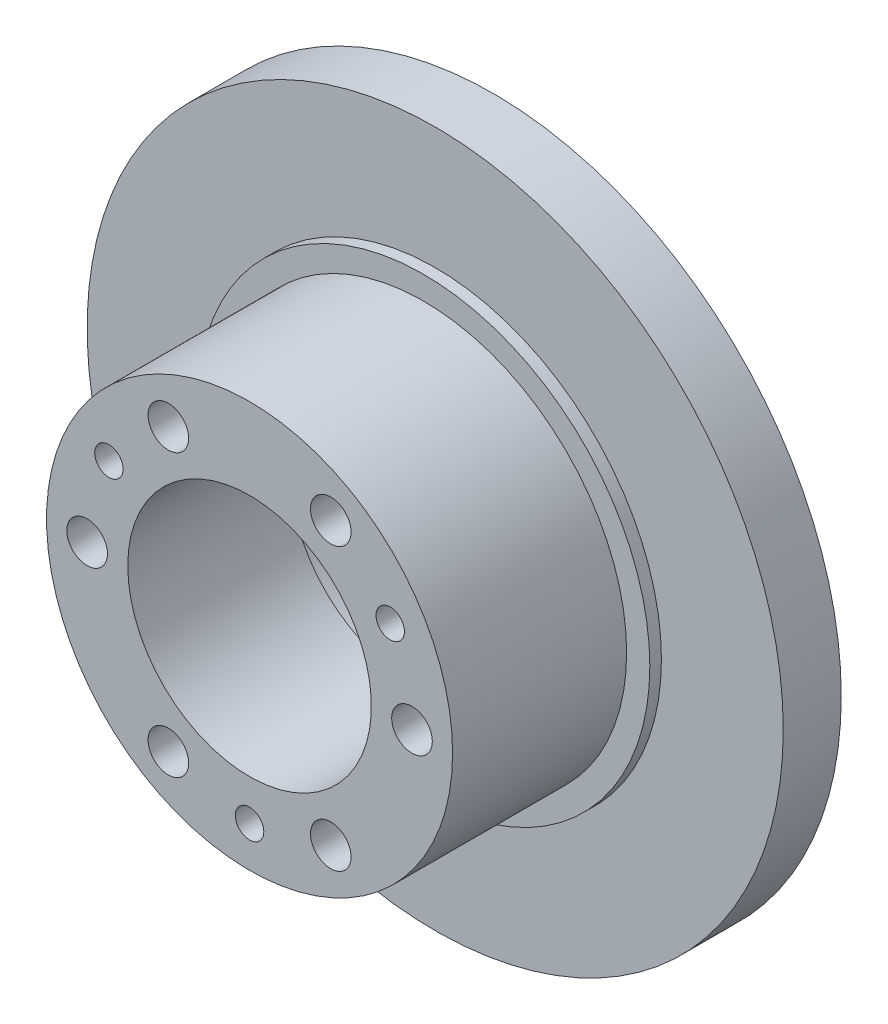
ISO-10303-21;
HEADER;
FILE_DESCRIPTION(('STEP AP214'),'2;1');
FILE_NAME('part.step','',(''),(''),'','','');
FILE_SCHEMA(('AUTOMOTIVE_DESIGN { 1 0 10303 214 1 1 1 1 }'));
ENDSEC;
DATA;
#1=APPLICATION_CONTEXT('core data for automotive mechanical design processes');
#2=APPLICATION_PROTOCOL_DEFINITION('international standard','automotive_design',2000,#1);
#3=PRODUCT_CONTEXT('',#1,'mechanical');
#4=PRODUCT('Part','Part','',(#3));
#5=PRODUCT_RELATED_PRODUCT_CATEGORY('part','',(#4));
#6=PRODUCT_DEFINITION_FORMATION('','',#4);
#7=PRODUCT_DEFINITION_CONTEXT('part definition',#1,'design');
#8=PRODUCT_DEFINITION('design','',#6,#7);
#9=PRODUCT_DEFINITION_SHAPE('','',#8);
#10=(LENGTH_UNIT() NAMED_UNIT(*) SI_UNIT(.MILLI.,.METRE.));
#11=(NAMED_UNIT(*) PLANE_ANGLE_UNIT() SI_UNIT($,.RADIAN.));
#12=(NAMED_UNIT(*) SI_UNIT($,.STERADIAN.) SOLID_ANGLE_UNIT());
#13=UNCERTAINTY_MEASURE_WITH_UNIT(LENGTH_MEASURE(1.E-05),#10,'distance_accuracy_value','');
#14=(GEOMETRIC_REPRESENTATION_CONTEXT(3) GLOBAL_UNCERTAINTY_ASSIGNED_CONTEXT((#13)) GLOBAL_UNIT_ASSIGNED_CONTEXT((#10,
#11,#12)) REPRESENTATION_CONTEXT('',''));
#15=CARTESIAN_POINT('',(0.,0.,0.));
#16=DIRECTION('',(0.,0.,1.));
#17=DIRECTION('',(1.,0.,0.));
#18=AXIS2_PLACEMENT_3D('',#15,#16,#17);
#19=CARTESIAN_POINT('',(0.,0.,5.));
#20=DIRECTION('',(0.,0.,-1.));
#21=DIRECTION('',(-1.,0.,0.));
#22=AXIS2_PLACEMENT_3D('',#19,#20,#21);
#23=CYLINDRICAL_SURFACE('',#22,30.);
#24=CARTESIAN_POINT('',(0.,0.,5.));
#25=DIRECTION('',(0.,0.,1.));
#26=DIRECTION('',(1.,0.,0.));
#27=AXIS2_PLACEMENT_3D('',#24,#25,#26);
#28=CIRCLE('',#27,30.);
#29=CARTESIAN_POINT('',(30.,0.,5.));
#30=VERTEX_POINT('',#29);
#31=EDGE_CURVE('E47',#30,#30,#28,.T.);
#32=ORIENTED_EDGE('',*,*,#31,.F.);
#33=EDGE_LOOP('',(#32));
#34=FACE_BOUND('',#33,.T.);
#35=CARTESIAN_POINT('',(0.,0.,0.));
#36=DIRECTION('',(0.,0.,1.));
#37=DIRECTION('',(1.,0.,0.));
#38=AXIS2_PLACEMENT_3D('',#35,#36,#37);
#39=CIRCLE('',#38,30.);
#40=CARTESIAN_POINT('',(30.,0.,0.));
#41=VERTEX_POINT('',#40);
#42=EDGE_CURVE('E55',#41,#41,#39,.T.);
#43=ORIENTED_EDGE('',*,*,#42,.T.);
#44=EDGE_LOOP('',(#43));
#45=FACE_BOUND('',#44,.T.);
#46=ADVANCED_FACE('F35',(#34,#45),#23,.T.);
#47=CARTESIAN_POINT('',(0.,0.,5.));
#48=DIRECTION('',(0.,0.,1.));
#49=DIRECTION('',(1.,0.,0.));
#50=AXIS2_PLACEMENT_3D('',#47,#48,#49);
#51=PLANE('',#50);
#52=CARTESIAN_POINT('',(0.,0.,5.));
#53=DIRECTION('',(0.,0.,1.));
#54=DIRECTION('',(1.,0.,0.));
#55=AXIS2_PLACEMENT_3D('',#52,#53,#54);
#56=CIRCLE('',#55,19.5);
#57=CARTESIAN_POINT('',(19.5,0.,5.));
#58=VERTEX_POINT('',#57);
#59=EDGE_CURVE('E42',#58,#58,#56,.T.);
#60=ORIENTED_EDGE('',*,*,#59,.F.);
#61=EDGE_LOOP('',(#60));
#62=FACE_BOUND('',#61,.T.);
#63=ORIENTED_EDGE('',*,*,#31,.T.);
#64=EDGE_LOOP('',(#63));
#65=FACE_BOUND('',#64,.T.);
#66=ADVANCED_FACE('F102',(#62,#65),#51,.T.);
#67=CARTESIAN_POINT('',(0.,0.,0.));
#68=DIRECTION('',(0.,0.,1.));
#69=DIRECTION('',(1.,0.,0.));
#70=AXIS2_PLACEMENT_3D('',#67,#68,#69);
#71=PLANE('',#70);
#72=CARTESIAN_POINT('',(24.5,0.,0.));
#73=DIRECTION('',(0.,0.,1.));
#74=DIRECTION('',(1.,0.,0.));
#75=AXIS2_PLACEMENT_3D('',#72,#73,#74);
#76=CIRCLE('',#75,2.);
#77=CARTESIAN_POINT('',(26.5,0.,0.));
#78=VERTEX_POINT('',#77);
#79=EDGE_CURVE('E38',#78,#78,#76,.F.);
#80=ORIENTED_EDGE('',*,*,#79,.F.);
#81=EDGE_LOOP('',(#80));
#82=FACE_BOUND('',#81,.T.);
#83=CARTESIAN_POINT('',(12.2500000000002,21.2176223927186,0.));
#84=DIRECTION('',(0.,0.,1.));
#85=DIRECTION('',(1.,0.,0.));
#86=AXIS2_PLACEMENT_3D('',#83,#84,#85);
#87=CIRCLE('',#86,2.);
#88=CARTESIAN_POINT('',(14.2500000000002,21.2176223927186,0.));
#89=VERTEX_POINT('',#88);
#90=EDGE_CURVE('E73',#89,#89,#87,.F.);
#91=ORIENTED_EDGE('',*,*,#90,.F.);
#92=EDGE_LOOP('',(#91));
#93=FACE_BOUND('',#92,.T.);
#94=CARTESIAN_POINT('',(-12.2499999999998,21.2176223927189,0.));
#95=DIRECTION('',(0.,0.,1.));
#96=DIRECTION('',(1.,0.,0.));
#97=AXIS2_PLACEMENT_3D('',#94,#95,#96);
#98=CIRCLE('',#97,2.);
#99=CARTESIAN_POINT('',(-10.2499999999998,21.2176223927189,0.));
#100=VERTEX_POINT('',#99);
#101=EDGE_CURVE('E71',#100,#100,#98,.F.);
#102=ORIENTED_EDGE('',*,*,#101,.F.);
#103=EDGE_LOOP('',(#102));
#104=FACE_BOUND('',#103,.T.);
#105=CARTESIAN_POINT('',(-24.5,1.71082585603314E-13,0.));
#106=DIRECTION('',(0.,0.,1.));
#107=DIRECTION('',(1.,0.,0.));
#108=AXIS2_PLACEMENT_3D('',#105,#106,#107);
#109=CIRCLE('',#108,2.);
#110=CARTESIAN_POINT('',(-22.5,1.71082585603314E-13,0.));
#111=VERTEX_POINT('',#110);
#112=EDGE_CURVE('E68',#111,#111,#109,.F.);
#113=ORIENTED_EDGE('',*,*,#112,.F.);
#114=EDGE_LOOP('',(#113));
#115=FACE_BOUND('',#114,.T.);
#116=CARTESIAN_POINT('',(-12.2500000000001,-21.2176223927187,0.));
#117=DIRECTION('',(0.,0.,1.));
#118=DIRECTION('',(1.,0.,0.));
#119=AXIS2_PLACEMENT_3D('',#116,#117,#118);
#120=CIRCLE('',#119,2.);
#121=CARTESIAN_POINT('',(-10.2500000000001,-21.2176223927187,0.));
#122=VERTEX_POINT('',#121);
#123=EDGE_CURVE('E64',#122,#122,#120,.F.);
#124=ORIENTED_EDGE('',*,*,#123,.F.);
#125=EDGE_LOOP('',(#124));
#126=FACE_BOUND('',#125,.T.);
#127=CARTESIAN_POINT('',(12.25,-21.2176223927188,0.));
#128=DIRECTION('',(0.,0.,1.));
#129=DIRECTION('',(1.,0.,0.));
#130=AXIS2_PLACEMENT_3D('',#127,#128,#129);
#131=CIRCLE('',#130,2.);
#132=CARTESIAN_POINT('',(14.25,-21.2176223927188,0.));
#133=VERTEX_POINT('',#132);
#134=EDGE_CURVE('E61',#133,#133,#131,.F.);
#135=ORIENTED_EDGE('',*,*,#134,.F.);
#136=EDGE_LOOP('',(#135));
#137=FACE_BOUND('',#136,.T.);
#138=CARTESIAN_POINT('',(0.,0.,0.));
#139=DIRECTION('',(0.,0.,-1.));
#140=DIRECTION('',(-1.,0.,0.));
#141=AXIS2_PLACEMENT_3D('',#138,#139,#140);
#142=CIRCLE('',#141,12.025);
#143=CARTESIAN_POINT('',(-12.025,0.,0.));
#144=VERTEX_POINT('',#143);
#145=EDGE_CURVE('E87',#144,#144,#142,.T.);
#146=ORIENTED_EDGE('',*,*,#145,.F.);
#147=EDGE_LOOP('',(#146));
#148=FACE_BOUND('',#147,.T.);
#149=ORIENTED_EDGE('',*,*,#42,.F.);
#150=EDGE_LOOP('',(#149));
#151=FACE_BOUND('',#150,.T.);
#152=ADVANCED_FACE('F98',(#82,#93,#104,#115,#126,#137,#148,#151),#71,.F.);
#153=CARTESIAN_POINT('',(0.,0.,6.));
#154=DIRECTION('',(0.,0.,-1.));
#155=DIRECTION('',(-1.,0.,0.));
#156=AXIS2_PLACEMENT_3D('',#153,#154,#155);
#157=CYLINDRICAL_SURFACE('',#156,19.5);
#158=CARTESIAN_POINT('',(0.,0.,6.));
#159=DIRECTION('',(0.,0.,1.));
#160=DIRECTION('',(1.,0.,0.));
#161=AXIS2_PLACEMENT_3D('',#158,#159,#160);
#162=CIRCLE('',#161,19.5);
#163=CARTESIAN_POINT('',(19.5,0.,6.));
#164=VERTEX_POINT('',#163);
#165=EDGE_CURVE('E53',#164,#164,#162,.T.);
#166=ORIENTED_EDGE('',*,*,#165,.F.);
#167=EDGE_LOOP('',(#166));
#168=FACE_BOUND('',#167,.T.);
#169=ORIENTED_EDGE('',*,*,#59,.T.);
#170=EDGE_LOOP('',(#169));
#171=FACE_BOUND('',#170,.T.);
#172=ADVANCED_FACE('F101',(#168,#171),#157,.T.);
#173=CARTESIAN_POINT('',(0.,0.,6.));
#174=DIRECTION('',(0.,0.,1.));
#175=DIRECTION('',(1.,0.,0.));
#176=AXIS2_PLACEMENT_3D('',#173,#174,#175);
#177=PLANE('',#176);
#178=CARTESIAN_POINT('',(0.,0.,6.));
#179=DIRECTION('',(0.,0.,1.));
#180=DIRECTION('',(1.,0.,0.));
#181=AXIS2_PLACEMENT_3D('',#178,#179,#180);
#182=CIRCLE('',#181,17.5);
#183=CARTESIAN_POINT('',(17.5,0.,6.));
#184=VERTEX_POINT('',#183);
#185=EDGE_CURVE('E10',#184,#184,#182,.T.);
#186=ORIENTED_EDGE('',*,*,#185,.F.);
#187=EDGE_LOOP('',(#186));
#188=FACE_BOUND('',#187,.T.);
#189=ORIENTED_EDGE('',*,*,#165,.T.);
#190=EDGE_LOOP('',(#189));
#191=FACE_BOUND('',#190,.T.);
#192=ADVANCED_FACE('F121',(#188,#191),#177,.T.);
#193=CARTESIAN_POINT('',(0.,0.,21.));
#194=DIRECTION('',(0.,0.,-1.));
#195=DIRECTION('',(-1.,0.,0.));
#196=AXIS2_PLACEMENT_3D('',#193,#194,#195);
#197=CYLINDRICAL_SURFACE('',#196,17.5);
#198=CARTESIAN_POINT('',(0.,0.,21.));
#199=DIRECTION('',(0.,0.,1.));
#200=DIRECTION('',(1.,0.,0.));
#201=AXIS2_PLACEMENT_3D('',#198,#199,#200);
#202=CIRCLE('',#201,17.5);
#203=CARTESIAN_POINT('',(17.5,0.,21.));
#204=VERTEX_POINT('',#203);
#205=EDGE_CURVE('E51',#204,#204,#202,.T.);
#206=ORIENTED_EDGE('',*,*,#205,.F.);
#207=EDGE_LOOP('',(#206));
#208=FACE_BOUND('',#207,.T.);
#209=ORIENTED_EDGE('',*,*,#185,.T.);
#210=EDGE_LOOP('',(#209));
#211=FACE_BOUND('',#210,.T.);
#212=ADVANCED_FACE('F125',(#208,#211),#197,.T.);
#213=CARTESIAN_POINT('',(0.,0.,21.));
#214=DIRECTION('',(0.,0.,1.));
#215=DIRECTION('',(1.,0.,0.));
#216=AXIS2_PLACEMENT_3D('',#213,#214,#215);
#217=PLANE('',#216);
#218=CARTESIAN_POINT('',(12.1243556529821,7.00000000000002,21.));
#219=DIRECTION('',(0.,0.,1.));
#220=DIRECTION('',(1.,0.,0.));
#221=AXIS2_PLACEMENT_3D('',#218,#219,#220);
#222=CIRCLE('',#221,1.225);
#223=CARTESIAN_POINT('',(13.3493556529821,7.00000000000002,21.));
#224=VERTEX_POINT('',#223);
#225=EDGE_CURVE('E270',#224,#224,#222,.T.);
#226=ORIENTED_EDGE('',*,*,#225,.F.);
#227=EDGE_LOOP('',(#226));
#228=FACE_BOUND('',#227,.T.);
#229=CARTESIAN_POINT('',(5.86982504876221E-13,-14.0000000000003,21.));
#230=DIRECTION('',(0.,0.,1.));
#231=DIRECTION('',(1.,0.,0.));
#232=AXIS2_PLACEMENT_3D('',#229,#230,#231);
#233=CIRCLE('',#232,1.22499999999981);
#234=CARTESIAN_POINT('',(1.22500000000039,-14.0000000000003,21.));
#235=VERTEX_POINT('',#234);
#236=EDGE_CURVE('E281',#235,#235,#233,.T.);
#237=ORIENTED_EDGE('',*,*,#236,.F.);
#238=EDGE_LOOP('',(#237));
#239=FACE_BOUND('',#238,.T.);
#240=CARTESIAN_POINT('',(-12.1243556529822,6.99999999999932,21.));
#241=DIRECTION('',(0.,0.,1.));
#242=DIRECTION('',(1.,0.,0.));
#243=AXIS2_PLACEMENT_3D('',#240,#241,#242);
#244=CIRCLE('',#243,1.22500000000048);
#245=CARTESIAN_POINT('',(-10.8993556529817,6.99999999999932,21.));
#246=VERTEX_POINT('',#245);
#247=EDGE_CURVE('E287',#246,#246,#244,.T.);
#248=ORIENTED_EDGE('',*,*,#247,.F.);
#249=EDGE_LOOP('',(#248));
#250=FACE_BOUND('',#249,.T.);
#251=CARTESIAN_POINT('',(14.,0.,21.));
#252=DIRECTION('',(0.,0.,1.));
#253=DIRECTION('',(1.,0.,0.));
#254=AXIS2_PLACEMENT_3D('',#251,#252,#253);
#255=CIRCLE('',#254,1.75);
#256=CARTESIAN_POINT('',(15.75,0.,21.));
#257=VERTEX_POINT('',#256);
#258=EDGE_CURVE('E294',#257,#257,#255,.T.);
#259=ORIENTED_EDGE('',*,*,#258,.F.);
#260=EDGE_LOOP('',(#259));
#261=FACE_BOUND('',#260,.T.);
#262=CARTESIAN_POINT('',(7.00000000000014,12.1243556529821,21.));
#263=DIRECTION('',(0.,0.,1.));
#264=DIRECTION('',(1.,0.,0.));
#265=AXIS2_PLACEMENT_3D('',#262,#263,#264);
#266=CIRCLE('',#265,1.75);
#267=CARTESIAN_POINT('',(8.75000000000014,12.1243556529821,21.));
#268=VERTEX_POINT('',#267);
#269=EDGE_CURVE('E269',#268,#268,#266,.T.);
#270=ORIENTED_EDGE('',*,*,#269,.F.);
#271=EDGE_LOOP('',(#270));
#272=FACE_BOUND('',#271,.T.);
#273=CARTESIAN_POINT('',(-6.99999999999989,12.1243556529822,21.));
#274=DIRECTION('',(0.,0.,1.));
#275=DIRECTION('',(1.,0.,0.));
#276=AXIS2_PLACEMENT_3D('',#273,#274,#275);
#277=CIRCLE('',#276,1.75);
#278=CARTESIAN_POINT('',(-5.24999999999989,12.1243556529822,21.));
#279=VERTEX_POINT('',#278);
#280=EDGE_CURVE('E299',#279,#279,#277,.T.);
#281=ORIENTED_EDGE('',*,*,#280,.F.);
#282=EDGE_LOOP('',(#281));
#283=FACE_BOUND('',#282,.T.);
#284=CARTESIAN_POINT('',(-14.,0.,21.));
#285=DIRECTION('',(0.,0.,1.));
#286=DIRECTION('',(1.,0.,0.));
#287=AXIS2_PLACEMENT_3D('',#284,#285,#286);
#288=CIRCLE('',#287,1.75);
#289=CARTESIAN_POINT('',(-12.25,0.,21.));
#290=VERTEX_POINT('',#289);
#291=EDGE_CURVE('E315',#290,#290,#288,.T.);
#292=ORIENTED_EDGE('',*,*,#291,.F.);
#293=EDGE_LOOP('',(#292));
#294=FACE_BOUND('',#293,.T.);
#295=CARTESIAN_POINT('',(-7.00000000000006,-12.1243556529821,21.));
#296=DIRECTION('',(0.,0.,1.));
#297=DIRECTION('',(1.,0.,0.));
#298=AXIS2_PLACEMENT_3D('',#295,#296,#297);
#299=CIRCLE('',#298,1.75);
#300=CARTESIAN_POINT('',(-5.25000000000006,-12.1243556529821,21.));
#301=VERTEX_POINT('',#300);
#302=EDGE_CURVE('E309',#301,#301,#299,.T.);
#303=ORIENTED_EDGE('',*,*,#302,.F.);
#304=EDGE_LOOP('',(#303));
#305=FACE_BOUND('',#304,.T.);
#306=CARTESIAN_POINT('',(6.99999999999997,-12.1243556529822,21.));
#307=DIRECTION('',(0.,0.,1.));
#308=DIRECTION('',(1.,0.,0.));
#309=AXIS2_PLACEMENT_3D('',#306,#307,#308);
#310=CIRCLE('',#309,1.75);
#311=CARTESIAN_POINT('',(8.74999999999997,-12.1243556529822,21.));
#312=VERTEX_POINT('',#311);
#313=EDGE_CURVE('E303',#312,#312,#310,.T.);
#314=ORIENTED_EDGE('',*,*,#313,.F.);
#315=EDGE_LOOP('',(#314));
#316=FACE_BOUND('',#315,.T.);
#317=CARTESIAN_POINT('',(0.,0.,21.));
#318=DIRECTION('',(0.,0.,-1.));
#319=DIRECTION('',(-1.,0.,0.));
#320=AXIS2_PLACEMENT_3D('',#317,#318,#319);
#321=CIRCLE('',#320,10.5);
#322=CARTESIAN_POINT('',(-10.5,0.,21.));
#323=VERTEX_POINT('',#322);
#324=EDGE_CURVE('E82',#323,#323,#321,.T.);
#325=ORIENTED_EDGE('',*,*,#324,.T.);
#326=EDGE_LOOP('',(#325));
#327=FACE_BOUND('',#326,.T.);
#328=ORIENTED_EDGE('',*,*,#205,.T.);
#329=EDGE_LOOP('',(#328));
#330=FACE_BOUND('',#329,.T.);
#331=ADVANCED_FACE('F129',(#228,#239,#250,#261,#272,#283,#294,#305,#316,#327,#330),#217,.T.);
#332=CARTESIAN_POINT('',(0.,0.,7.));
#333=DIRECTION('',(0.,0.,-1.));
#334=DIRECTION('',(-1.,0.,0.));
#335=AXIS2_PLACEMENT_3D('',#332,#333,#334);
#336=CYLINDRICAL_SURFACE('',#335,12.025);
#337=CARTESIAN_POINT('',(0.,0.,7.));
#338=DIRECTION('',(0.,0.,-1.));
#339=DIRECTION('',(-1.,0.,0.));
#340=AXIS2_PLACEMENT_3D('',#337,#338,#339);
#341=CIRCLE('',#340,12.025);
#342=CARTESIAN_POINT('',(-12.025,0.,7.));
#343=VERTEX_POINT('',#342);
#344=EDGE_CURVE('E91',#343,#343,#341,.T.);
#345=ORIENTED_EDGE('',*,*,#344,.F.);
#346=EDGE_LOOP('',(#345));
#347=FACE_BOUND('',#346,.T.);
#348=ORIENTED_EDGE('',*,*,#145,.T.);
#349=EDGE_LOOP('',(#348));
#350=FACE_BOUND('',#349,.T.);
#351=ADVANCED_FACE('F96',(#347,#350),#336,.F.);
#352=CARTESIAN_POINT('',(0.,0.,7.));
#353=DIRECTION('',(0.,0.,-1.));
#354=DIRECTION('',(-1.,0.,0.));
#355=AXIS2_PLACEMENT_3D('',#352,#353,#354);
#356=PLANE('',#355);
#357=CARTESIAN_POINT('',(0.,0.,7.));
#358=DIRECTION('',(0.,0.,-1.));
#359=DIRECTION('',(-1.,0.,0.));
#360=AXIS2_PLACEMENT_3D('',#357,#358,#359);
#361=CIRCLE('',#360,10.5);
#362=CARTESIAN_POINT('',(-10.5,0.,7.));
#363=VERTEX_POINT('',#362);
#364=EDGE_CURVE('E78',#363,#363,#361,.T.);
#365=ORIENTED_EDGE('',*,*,#364,.F.);
#366=EDGE_LOOP('',(#365));
#367=FACE_BOUND('',#366,.T.);
#368=ORIENTED_EDGE('',*,*,#344,.T.);
#369=EDGE_LOOP('',(#368));
#370=FACE_BOUND('',#369,.T.);
#371=ADVANCED_FACE('F136',(#367,#370),#356,.T.);
#372=CARTESIAN_POINT('',(0.,0.,21.));
#373=DIRECTION('',(0.,0.,-1.));
#374=DIRECTION('',(-1.,0.,0.));
#375=AXIS2_PLACEMENT_3D('',#372,#373,#374);
#376=CYLINDRICAL_SURFACE('',#375,10.5);
#377=CARTESIAN_POINT('',(-10.5,0.,21.));
#378=CARTESIAN_POINT('',(-10.5,0.,20.8541666666667));
#379=CARTESIAN_POINT('',(-10.5,0.,20.7083333333333));
#380=CARTESIAN_POINT('',(-10.5,0.,20.4166666666667));
#381=CARTESIAN_POINT('',(-10.5,0.,20.2708333333333));
#382=CARTESIAN_POINT('',(-10.5,0.,19.9791666666667));
#383=CARTESIAN_POINT('',(-10.5,0.,19.8333333333333));
#384=CARTESIAN_POINT('',(-10.5,0.,19.5416666666667));
#385=CARTESIAN_POINT('',(-10.5,0.,19.3958333333333));
#386=CARTESIAN_POINT('',(-10.5,0.,19.1041666666667));
#387=CARTESIAN_POINT('',(-10.5,0.,18.9583333333333));
#388=CARTESIAN_POINT('',(-10.5,0.,18.6666666666667));
#389=CARTESIAN_POINT('',(-10.5,0.,18.5208333333333));
#390=CARTESIAN_POINT('',(-10.5,0.,18.2291666666667));
#391=CARTESIAN_POINT('',(-10.5,0.,18.0833333333333));
#392=CARTESIAN_POINT('',(-10.5,0.,17.7916666666667));
#393=CARTESIAN_POINT('',(-10.5,0.,17.6458333333333));
#394=CARTESIAN_POINT('',(-10.5,0.,17.3541666666667));
#395=CARTESIAN_POINT('',(-10.5,0.,17.2083333333333));
#396=CARTESIAN_POINT('',(-10.5,0.,16.9166666666667));
#397=CARTESIAN_POINT('',(-10.5,0.,16.7708333333333));
#398=CARTESIAN_POINT('',(-10.5,0.,16.4791666666667));
#399=CARTESIAN_POINT('',(-10.5,0.,16.3333333333333));
#400=CARTESIAN_POINT('',(-10.5,0.,16.0416666666667));
#401=CARTESIAN_POINT('',(-10.5,0.,15.8958333333333));
#402=CARTESIAN_POINT('',(-10.5,0.,15.6041666666667));
#403=CARTESIAN_POINT('',(-10.5,0.,15.4583333333333));
#404=CARTESIAN_POINT('',(-10.5,0.,15.1666666666667));
#405=CARTESIAN_POINT('',(-10.5,0.,15.0208333333333));
#406=CARTESIAN_POINT('',(-10.5,0.,14.7291666666667));
#407=CARTESIAN_POINT('',(-10.5,0.,14.5833333333333));
#408=CARTESIAN_POINT('',(-10.5,0.,14.2916666666667));
#409=CARTESIAN_POINT('',(-10.5,0.,14.1458333333333));
#410=CARTESIAN_POINT('',(-10.5,0.,13.8541666666667));
#411=CARTESIAN_POINT('',(-10.5,0.,13.7083333333333));
#412=CARTESIAN_POINT('',(-10.5,0.,13.4166666666667));
#413=CARTESIAN_POINT('',(-10.5,0.,13.2708333333333));
#414=CARTESIAN_POINT('',(-10.5,0.,12.9791666666667));
#415=CARTESIAN_POINT('',(-10.5,0.,12.8333333333333));
#416=CARTESIAN_POINT('',(-10.5,0.,12.5416666666667));
#417=CARTESIAN_POINT('',(-10.5,0.,12.3958333333333));
#418=CARTESIAN_POINT('',(-10.5,0.,12.1041666666667));
#419=CARTESIAN_POINT('',(-10.5,0.,11.9583333333333));
#420=CARTESIAN_POINT('',(-10.5,0.,11.6666666666667));
#421=CARTESIAN_POINT('',(-10.5,0.,11.5208333333333));
#422=CARTESIAN_POINT('',(-10.5,0.,11.2291666666667));
#423=CARTESIAN_POINT('',(-10.5,0.,11.0833333333333));
#424=CARTESIAN_POINT('',(-10.5,0.,10.7916666666667));
#425=CARTESIAN_POINT('',(-10.5,0.,10.6458333333333));
#426=CARTESIAN_POINT('',(-10.5,0.,10.3541666666667));
#427=CARTESIAN_POINT('',(-10.5,0.,10.2083333333333));
#428=CARTESIAN_POINT('',(-10.5,0.,9.91666666666667));
#429=CARTESIAN_POINT('',(-10.5,0.,9.77083333333333));
#430=CARTESIAN_POINT('',(-10.5,0.,9.47916666666667));
#431=CARTESIAN_POINT('',(-10.5,0.,9.33333333333333));
#432=CARTESIAN_POINT('',(-10.5,0.,9.04166666666667));
#433=CARTESIAN_POINT('',(-10.5,0.,8.89583333333333));
#434=CARTESIAN_POINT('',(-10.5,0.,8.60416666666667));
#435=CARTESIAN_POINT('',(-10.5,0.,8.45833333333333));
#436=CARTESIAN_POINT('',(-10.5,0.,8.16666666666667));
#437=CARTESIAN_POINT('',(-10.5,0.,8.02083333333333));
#438=CARTESIAN_POINT('',(-10.5,0.,7.72916666666667));
#439=CARTESIAN_POINT('',(-10.5,0.,7.58333333333333));
#440=CARTESIAN_POINT('',(-10.5,0.,7.29166666666667));
#441=CARTESIAN_POINT('',(-10.5,0.,7.14583333333333));
#442=CARTESIAN_POINT('',(-10.5,0.,7.));
#443=B_SPLINE_CURVE_WITH_KNOTS('',3,(#377,#378,#379,#380,#381,#382,#383,#384,#385,#386,#387,
#388,#389,#390,#391,#392,#393,#394,#395,#396,#397,#398,#399,#400,#401,#402,#403,#404,#405,#406,
#407,#408,#409,#410,#411,#412,#413,#414,#415,#416,#417,#418,#419,#420,#421,#422,#423,#424,#425,
#426,#427,#428,#429,#430,#431,#432,#433,#434,#435,#436,#437,#438,#439,#440,#441,#442),
.UNSPECIFIED.,.F.,.F.,(4,2,2,2,2,2,2,2,2,2,2,2,2,2,2,2,2,2,2,2,2,2,2,2,2,2,2,2,2,2,2,2,4),(0.,
0.4375,0.875000000000001,1.3125,1.75,2.1875,2.625,3.0625,3.5,3.9375,4.375,4.8125,5.25,5.6875,
6.125,6.5625,7.,7.4375,7.875,8.3125,8.75,9.1875,9.625,10.0625,10.5,10.9375,11.375,11.8125,12.25,
12.6875,13.125,13.5625,14.),.UNSPECIFIED.);
#444=EDGE_CURVE('BSEAM140',#323,#363,#443,.T.);
#445=ORIENTED_EDGE('',*,*,#324,.F.);
#446=ORIENTED_EDGE('',*,*,#364,.T.);
#447=ORIENTED_EDGE('',*,*,#444,.T.);
#448=ORIENTED_EDGE('',*,*,#444,.F.);
#449=EDGE_LOOP('',(#445,#447,#446,#448));
#450=FACE_BOUND('',#449,.T.);
#451=ADVANCED_FACE('F140',(#450),#376,.F.);
#452=CARTESIAN_POINT('',(12.25,-21.2176223927188,4.));
#453=DIRECTION('',(0.,0.,-1.));
#454=DIRECTION('',(-1.,0.,0.));
#455=AXIS2_PLACEMENT_3D('',#452,#453,#454);
#456=CYLINDRICAL_SURFACE('',#455,2.);
#457=CARTESIAN_POINT('',(12.25,-21.2176223927188,4.));
#458=DIRECTION('',(0.,0.,1.));
#459=DIRECTION('',(1.,0.,0.));
#460=AXIS2_PLACEMENT_3D('',#457,#458,#459);
#461=CIRCLE('',#460,2.);
#462=CARTESIAN_POINT('',(14.25,-21.2176223927188,4.));
#463=VERTEX_POINT('',#462);
#464=EDGE_CURVE('E325',#463,#463,#461,.T.);
#465=ORIENTED_EDGE('',*,*,#464,.T.);
#466=EDGE_LOOP('',(#465));
#467=FACE_BOUND('',#466,.T.);
#468=ORIENTED_EDGE('',*,*,#134,.T.);
#469=EDGE_LOOP('',(#468));
#470=FACE_BOUND('',#469,.T.);
#471=ADVANCED_FACE('F144',(#467,#470),#456,.F.);
#472=CARTESIAN_POINT('',(12.25,-21.2176223927188,4.));
#473=DIRECTION('',(0.,0.,1.));
#474=DIRECTION('',(1.,0.,0.));
#475=AXIS2_PLACEMENT_3D('',#472,#473,#474);
#476=PLANE('',#475);
#477=ORIENTED_EDGE('',*,*,#464,.F.);
#478=EDGE_LOOP('',(#477));
#479=FACE_BOUND('',#478,.T.);
#480=ADVANCED_FACE('F167',(#479),#476,.F.);
#481=CARTESIAN_POINT('',(-12.2500000000001,-21.2176223927187,4.));
#482=DIRECTION('',(0.,0.,-1.));
#483=DIRECTION('',(-1.,0.,0.));
#484=AXIS2_PLACEMENT_3D('',#481,#482,#483);
#485=CYLINDRICAL_SURFACE('',#484,2.);
#486=CARTESIAN_POINT('',(-12.2500000000001,-21.2176223927187,4.));
#487=DIRECTION('',(0.,0.,1.));
#488=DIRECTION('',(1.,0.,0.));
#489=AXIS2_PLACEMENT_3D('',#486,#487,#488);
#490=CIRCLE('',#489,2.);
#491=CARTESIAN_POINT('',(-10.2500000000001,-21.2176223927187,4.));
#492=VERTEX_POINT('',#491);
#493=EDGE_CURVE('E331',#492,#492,#490,.T.);
#494=ORIENTED_EDGE('',*,*,#493,.T.);
#495=EDGE_LOOP('',(#494));
#496=FACE_BOUND('',#495,.T.);
#497=ORIENTED_EDGE('',*,*,#123,.T.);
#498=EDGE_LOOP('',(#497));
#499=FACE_BOUND('',#498,.T.);
#500=ADVANCED_FACE('F164',(#496,#499),#485,.F.);
#501=CARTESIAN_POINT('',(-12.2500000000001,-21.2176223927187,4.));
#502=DIRECTION('',(0.,0.,1.));
#503=DIRECTION('',(1.,0.,0.));
#504=AXIS2_PLACEMENT_3D('',#501,#502,#503);
#505=PLANE('',#504);
#506=ORIENTED_EDGE('',*,*,#493,.F.);
#507=EDGE_LOOP('',(#506));
#508=FACE_BOUND('',#507,.T.);
#509=ADVANCED_FACE('F159',(#508),#505,.F.);
#510=CARTESIAN_POINT('',(-24.5,1.71082585603314E-13,4.));
#511=DIRECTION('',(0.,0.,-1.));
#512=DIRECTION('',(-1.,0.,0.));
#513=AXIS2_PLACEMENT_3D('',#510,#511,#512);
#514=CYLINDRICAL_SURFACE('',#513,2.);
#515=CARTESIAN_POINT('',(-24.5,1.71082585603314E-13,4.));
#516=DIRECTION('',(0.,0.,1.));
#517=DIRECTION('',(1.,0.,0.));
#518=AXIS2_PLACEMENT_3D('',#515,#516,#517);
#519=CIRCLE('',#518,2.);
#520=CARTESIAN_POINT('',(-22.5,1.71082585603314E-13,4.));
#521=VERTEX_POINT('',#520);
#522=EDGE_CURVE('E334',#521,#521,#519,.T.);
#523=ORIENTED_EDGE('',*,*,#522,.T.);
#524=EDGE_LOOP('',(#523));
#525=FACE_BOUND('',#524,.T.);
#526=ORIENTED_EDGE('',*,*,#112,.T.);
#527=EDGE_LOOP('',(#526));
#528=FACE_BOUND('',#527,.T.);
#529=ADVANCED_FACE('F156',(#525,#528),#514,.F.);
#530=CARTESIAN_POINT('',(-24.5,1.71082585603314E-13,4.));
#531=DIRECTION('',(0.,0.,1.));
#532=DIRECTION('',(1.,0.,0.));
#533=AXIS2_PLACEMENT_3D('',#530,#531,#532);
#534=PLANE('',#533);
#535=ORIENTED_EDGE('',*,*,#522,.F.);
#536=EDGE_LOOP('',(#535));
#537=FACE_BOUND('',#536,.T.);
#538=ADVANCED_FACE('F150',(#537),#534,.F.);
#539=CARTESIAN_POINT('',(-12.2499999999998,21.2176223927189,4.));
#540=DIRECTION('',(0.,0.,-1.));
#541=DIRECTION('',(-1.,0.,0.));
#542=AXIS2_PLACEMENT_3D('',#539,#540,#541);
#543=CYLINDRICAL_SURFACE('',#542,2.);
#544=CARTESIAN_POINT('',(-12.2499999999998,21.2176223927189,4.));
#545=DIRECTION('',(0.,0.,1.));
#546=DIRECTION('',(1.,0.,0.));
#547=AXIS2_PLACEMENT_3D('',#544,#545,#546);
#548=CIRCLE('',#547,2.);
#549=CARTESIAN_POINT('',(-10.2499999999998,21.2176223927189,4.));
#550=VERTEX_POINT('',#549);
#551=EDGE_CURVE('E328',#550,#550,#548,.T.);
#552=ORIENTED_EDGE('',*,*,#551,.T.);
#553=EDGE_LOOP('',(#552));
#554=FACE_BOUND('',#553,.T.);
#555=ORIENTED_EDGE('',*,*,#101,.T.);
#556=EDGE_LOOP('',(#555));
#557=FACE_BOUND('',#556,.T.);
#558=ADVANCED_FACE('F146',(#554,#557),#543,.F.);
#559=CARTESIAN_POINT('',(-12.2499999999998,21.2176223927189,4.));
#560=DIRECTION('',(0.,0.,1.));
#561=DIRECTION('',(1.,0.,0.));
#562=AXIS2_PLACEMENT_3D('',#559,#560,#561);
#563=PLANE('',#562);
#564=ORIENTED_EDGE('',*,*,#551,.F.);
#565=EDGE_LOOP('',(#564));
#566=FACE_BOUND('',#565,.T.);
#567=ADVANCED_FACE('F149',(#566),#563,.F.);
#568=CARTESIAN_POINT('',(12.2500000000002,21.2176223927186,4.));
#569=DIRECTION('',(0.,0.,-1.));
#570=DIRECTION('',(-1.,0.,0.));
#571=AXIS2_PLACEMENT_3D('',#568,#569,#570);
#572=CYLINDRICAL_SURFACE('',#571,2.);
#573=CARTESIAN_POINT('',(12.2500000000002,21.2176223927186,4.));
#574=DIRECTION('',(0.,0.,1.));
#575=DIRECTION('',(1.,0.,0.));
#576=AXIS2_PLACEMENT_3D('',#573,#574,#575);
#577=CIRCLE('',#576,2.);
#578=CARTESIAN_POINT('',(14.2500000000002,21.2176223927186,4.));
#579=VERTEX_POINT('',#578);
#580=EDGE_CURVE('E293',#579,#579,#577,.T.);
#581=ORIENTED_EDGE('',*,*,#580,.T.);
#582=EDGE_LOOP('',(#581));
#583=FACE_BOUND('',#582,.T.);
#584=ORIENTED_EDGE('',*,*,#90,.T.);
#585=EDGE_LOOP('',(#584));
#586=FACE_BOUND('',#585,.T.);
#587=ADVANCED_FACE('F154',(#583,#586),#572,.F.);
#588=CARTESIAN_POINT('',(12.2500000000002,21.2176223927186,4.));
#589=DIRECTION('',(0.,0.,1.));
#590=DIRECTION('',(1.,0.,0.));
#591=AXIS2_PLACEMENT_3D('',#588,#589,#590);
#592=PLANE('',#591);
#593=ORIENTED_EDGE('',*,*,#580,.F.);
#594=EDGE_LOOP('',(#593));
#595=FACE_BOUND('',#594,.T.);
#596=ADVANCED_FACE('F180',(#595),#592,.F.);
#597=CARTESIAN_POINT('',(24.5,0.,4.));
#598=DIRECTION('',(0.,0.,-1.));
#599=DIRECTION('',(-1.,0.,0.));
#600=AXIS2_PLACEMENT_3D('',#597,#598,#599);
#601=CYLINDRICAL_SURFACE('',#600,2.);
#602=CARTESIAN_POINT('',(24.5,0.,4.));
#603=DIRECTION('',(0.,0.,1.));
#604=DIRECTION('',(1.,0.,0.));
#605=AXIS2_PLACEMENT_3D('',#602,#603,#604);
#606=CIRCLE('',#605,2.);
#607=CARTESIAN_POINT('',(26.5,0.,4.));
#608=VERTEX_POINT('',#607);
#609=EDGE_CURVE('E65',#608,#608,#606,.T.);
#610=ORIENTED_EDGE('',*,*,#609,.T.);
#611=EDGE_LOOP('',(#610));
#612=FACE_BOUND('',#611,.T.);
#613=ORIENTED_EDGE('',*,*,#79,.T.);
#614=EDGE_LOOP('',(#613));
#615=FACE_BOUND('',#614,.T.);
#616=ADVANCED_FACE('F184',(#612,#615),#601,.F.);
#617=CARTESIAN_POINT('',(24.5,0.,4.));
#618=DIRECTION('',(0.,0.,1.));
#619=DIRECTION('',(1.,0.,0.));
#620=AXIS2_PLACEMENT_3D('',#617,#618,#619);
#621=PLANE('',#620);
#622=ORIENTED_EDGE('',*,*,#609,.F.);
#623=EDGE_LOOP('',(#622));
#624=FACE_BOUND('',#623,.T.);
#625=ADVANCED_FACE('F188',(#624),#621,.F.);
#626=CARTESIAN_POINT('',(6.99999999999997,-12.1243556529822,11.));
#627=DIRECTION('',(0.,0.,1.));
#628=DIRECTION('',(1.,0.,0.));
#629=AXIS2_PLACEMENT_3D('',#626,#627,#628);
#630=CYLINDRICAL_SURFACE('',#629,1.75);
#631=CARTESIAN_POINT('',(6.99999999999997,-12.1243556529822,11.));
#632=DIRECTION('',(0.,0.,1.));
#633=DIRECTION('',(1.,0.,0.));
#634=AXIS2_PLACEMENT_3D('',#631,#632,#633);
#635=CIRCLE('',#634,1.75);
#636=CARTESIAN_POINT('',(8.74999999999997,-12.1243556529822,11.));
#637=VERTEX_POINT('',#636);
#638=EDGE_CURVE('E297',#637,#637,#635,.T.);
#639=ORIENTED_EDGE('',*,*,#638,.F.);
#640=EDGE_LOOP('',(#639));
#641=FACE_BOUND('',#640,.T.);
#642=ORIENTED_EDGE('',*,*,#313,.T.);
#643=EDGE_LOOP('',(#642));
#644=FACE_BOUND('',#643,.T.);
#645=ADVANCED_FACE('F192',(#641,#644),#630,.F.);
#646=CARTESIAN_POINT('',(6.99999999999997,-12.1243556529822,11.));
#647=DIRECTION('',(0.,0.,1.));
#648=DIRECTION('',(1.,0.,0.));
#649=AXIS2_PLACEMENT_3D('',#646,#647,#648);
#650=PLANE('',#649);
#651=ORIENTED_EDGE('',*,*,#638,.T.);
#652=EDGE_LOOP('',(#651));
#653=FACE_BOUND('',#652,.T.);
#654=ADVANCED_FACE('F215',(#653),#650,.T.);
#655=CARTESIAN_POINT('',(-7.00000000000006,-12.1243556529821,11.));
#656=DIRECTION('',(0.,0.,1.));
#657=DIRECTION('',(1.,0.,0.));
#658=AXIS2_PLACEMENT_3D('',#655,#656,#657);
#659=CYLINDRICAL_SURFACE('',#658,1.75);
#660=CARTESIAN_POINT('',(-7.00000000000006,-12.1243556529821,11.));
#661=DIRECTION('',(0.,0.,1.));
#662=DIRECTION('',(1.,0.,0.));
#663=AXIS2_PLACEMENT_3D('',#660,#661,#662);
#664=CIRCLE('',#663,1.75);
#665=CARTESIAN_POINT('',(-5.25000000000006,-12.1243556529821,11.));
#666=VERTEX_POINT('',#665);
#667=EDGE_CURVE('E306',#666,#666,#664,.T.);
#668=ORIENTED_EDGE('',*,*,#667,.F.);
#669=EDGE_LOOP('',(#668));
#670=FACE_BOUND('',#669,.T.);
#671=ORIENTED_EDGE('',*,*,#302,.T.);
#672=EDGE_LOOP('',(#671));
#673=FACE_BOUND('',#672,.T.);
#674=ADVANCED_FACE('F212',(#670,#673),#659,.F.);
#675=CARTESIAN_POINT('',(-7.00000000000006,-12.1243556529821,11.));
#676=DIRECTION('',(0.,0.,1.));
#677=DIRECTION('',(1.,0.,0.));
#678=AXIS2_PLACEMENT_3D('',#675,#676,#677);
#679=PLANE('',#678);
#680=ORIENTED_EDGE('',*,*,#667,.T.);
#681=EDGE_LOOP('',(#680));
#682=FACE_BOUND('',#681,.T.);
#683=ADVANCED_FACE('F207',(#682),#679,.T.);
#684=CARTESIAN_POINT('',(-14.,0.,11.));
#685=DIRECTION('',(0.,0.,1.));
#686=DIRECTION('',(1.,0.,0.));
#687=AXIS2_PLACEMENT_3D('',#684,#685,#686);
#688=CYLINDRICAL_SURFACE('',#687,1.75);
#689=CARTESIAN_POINT('',(-14.,0.,11.));
#690=DIRECTION('',(0.,0.,1.));
#691=DIRECTION('',(1.,0.,0.));
#692=AXIS2_PLACEMENT_3D('',#689,#690,#691);
#693=CIRCLE('',#692,1.75);
#694=CARTESIAN_POINT('',(-12.25,0.,11.));
#695=VERTEX_POINT('',#694);
#696=EDGE_CURVE('E312',#695,#695,#693,.T.);
#697=ORIENTED_EDGE('',*,*,#696,.F.);
#698=EDGE_LOOP('',(#697));
#699=FACE_BOUND('',#698,.T.);
#700=ORIENTED_EDGE('',*,*,#291,.T.);
#701=EDGE_LOOP('',(#700));
#702=FACE_BOUND('',#701,.T.);
#703=ADVANCED_FACE('F204',(#699,#702),#688,.F.);
#704=CARTESIAN_POINT('',(-14.,0.,11.));
#705=DIRECTION('',(0.,0.,1.));
#706=DIRECTION('',(1.,0.,0.));
#707=AXIS2_PLACEMENT_3D('',#704,#705,#706);
#708=PLANE('',#707);
#709=ORIENTED_EDGE('',*,*,#696,.T.);
#710=EDGE_LOOP('',(#709));
#711=FACE_BOUND('',#710,.T.);
#712=ADVANCED_FACE('F198',(#711),#708,.T.);
#713=CARTESIAN_POINT('',(-6.99999999999989,12.1243556529822,11.));
#714=DIRECTION('',(0.,0.,1.));
#715=DIRECTION('',(1.,0.,0.));
#716=AXIS2_PLACEMENT_3D('',#713,#714,#715);
#717=CYLINDRICAL_SURFACE('',#716,1.75);
#718=CARTESIAN_POINT('',(-6.99999999999989,12.1243556529822,11.));
#719=DIRECTION('',(0.,0.,1.));
#720=DIRECTION('',(1.,0.,0.));
#721=AXIS2_PLACEMENT_3D('',#718,#719,#720);
#722=CIRCLE('',#721,1.75);
#723=CARTESIAN_POINT('',(-5.24999999999989,12.1243556529822,11.));
#724=VERTEX_POINT('',#723);
#725=EDGE_CURVE('E318',#724,#724,#722,.T.);
#726=ORIENTED_EDGE('',*,*,#725,.F.);
#727=EDGE_LOOP('',(#726));
#728=FACE_BOUND('',#727,.T.);
#729=ORIENTED_EDGE('',*,*,#280,.T.);
#730=EDGE_LOOP('',(#729));
#731=FACE_BOUND('',#730,.T.);
#732=ADVANCED_FACE('F194',(#728,#731),#717,.F.);
#733=CARTESIAN_POINT('',(-6.99999999999989,12.1243556529822,11.));
#734=DIRECTION('',(0.,0.,1.));
#735=DIRECTION('',(1.,0.,0.));
#736=AXIS2_PLACEMENT_3D('',#733,#734,#735);
#737=PLANE('',#736);
#738=ORIENTED_EDGE('',*,*,#725,.T.);
#739=EDGE_LOOP('',(#738));
#740=FACE_BOUND('',#739,.T.);
#741=ADVANCED_FACE('F197',(#740),#737,.T.);
#742=CARTESIAN_POINT('',(7.00000000000014,12.1243556529821,11.));
#743=DIRECTION('',(0.,0.,1.));
#744=DIRECTION('',(1.,0.,0.));
#745=AXIS2_PLACEMENT_3D('',#742,#743,#744);
#746=CYLINDRICAL_SURFACE('',#745,1.75);
#747=CARTESIAN_POINT('',(7.00000000000014,12.1243556529821,11.));
#748=DIRECTION('',(0.,0.,1.));
#749=DIRECTION('',(1.,0.,0.));
#750=AXIS2_PLACEMENT_3D('',#747,#748,#749);
#751=CIRCLE('',#750,1.75);
#752=CARTESIAN_POINT('',(8.75000000000014,12.1243556529821,11.));
#753=VERTEX_POINT('',#752);
#754=EDGE_CURVE('E273',#753,#753,#751,.T.);
#755=ORIENTED_EDGE('',*,*,#754,.F.);
#756=EDGE_LOOP('',(#755));
#757=FACE_BOUND('',#756,.T.);
#758=ORIENTED_EDGE('',*,*,#269,.T.);
#759=EDGE_LOOP('',(#758));
#760=FACE_BOUND('',#759,.T.);
#761=ADVANCED_FACE('F202',(#757,#760),#746,.F.);
#762=CARTESIAN_POINT('',(7.00000000000014,12.1243556529821,11.));
#763=DIRECTION('',(0.,0.,1.));
#764=DIRECTION('',(1.,0.,0.));
#765=AXIS2_PLACEMENT_3D('',#762,#763,#764);
#766=PLANE('',#765);
#767=ORIENTED_EDGE('',*,*,#754,.T.);
#768=EDGE_LOOP('',(#767));
#769=FACE_BOUND('',#768,.T.);
#770=ADVANCED_FACE('F228',(#769),#766,.T.);
#771=CARTESIAN_POINT('',(14.,0.,11.));
#772=DIRECTION('',(0.,0.,1.));
#773=DIRECTION('',(1.,0.,0.));
#774=AXIS2_PLACEMENT_3D('',#771,#772,#773);
#775=CYLINDRICAL_SURFACE('',#774,1.75);
#776=CARTESIAN_POINT('',(14.,0.,11.));
#777=DIRECTION('',(0.,0.,1.));
#778=DIRECTION('',(1.,0.,0.));
#779=AXIS2_PLACEMENT_3D('',#776,#777,#778);
#780=CIRCLE('',#779,1.75);
#781=CARTESIAN_POINT('',(15.75,0.,11.));
#782=VERTEX_POINT('',#781);
#783=EDGE_CURVE('E290',#782,#782,#780,.T.);
#784=ORIENTED_EDGE('',*,*,#783,.F.);
#785=EDGE_LOOP('',(#784));
#786=FACE_BOUND('',#785,.T.);
#787=ORIENTED_EDGE('',*,*,#258,.T.);
#788=EDGE_LOOP('',(#787));
#789=FACE_BOUND('',#788,.T.);
#790=ADVANCED_FACE('F232',(#786,#789),#775,.F.);
#791=CARTESIAN_POINT('',(14.,0.,11.));
#792=DIRECTION('',(0.,0.,1.));
#793=DIRECTION('',(1.,0.,0.));
#794=AXIS2_PLACEMENT_3D('',#791,#792,#793);
#795=PLANE('',#794);
#796=ORIENTED_EDGE('',*,*,#783,.T.);
#797=EDGE_LOOP('',(#796));
#798=FACE_BOUND('',#797,.T.);
#799=ADVANCED_FACE('F236',(#798),#795,.T.);
#800=CARTESIAN_POINT('',(-12.1243556529822,6.99999999999932,9.));
#801=DIRECTION('',(0.,0.,1.));
#802=DIRECTION('',(1.,0.,0.));
#803=AXIS2_PLACEMENT_3D('',#800,#801,#802);
#804=CYLINDRICAL_SURFACE('',#803,1.22500000000048);
#805=CARTESIAN_POINT('',(-12.1243556529822,6.99999999999932,9.));
#806=DIRECTION('',(0.,0.,1.));
#807=DIRECTION('',(1.,0.,0.));
#808=AXIS2_PLACEMENT_3D('',#805,#806,#807);
#809=CIRCLE('',#808,1.22500000000048);
#810=CARTESIAN_POINT('',(-10.8993556529817,6.99999999999932,9.));
#811=VERTEX_POINT('',#810);
#812=EDGE_CURVE('E284',#811,#811,#809,.T.);
#813=ORIENTED_EDGE('',*,*,#812,.F.);
#814=EDGE_LOOP('',(#813));
#815=FACE_BOUND('',#814,.T.);
#816=ORIENTED_EDGE('',*,*,#247,.T.);
#817=EDGE_LOOP('',(#816));
#818=FACE_BOUND('',#817,.T.);
#819=ADVANCED_FACE('F240',(#815,#818),#804,.F.);
#820=CARTESIAN_POINT('',(-12.1243556529822,6.99999999999932,9.));
#821=DIRECTION('',(0.,0.,1.));
#822=DIRECTION('',(1.,0.,0.));
#823=AXIS2_PLACEMENT_3D('',#820,#821,#822);
#824=PLANE('',#823);
#825=ORIENTED_EDGE('',*,*,#812,.T.);
#826=EDGE_LOOP('',(#825));
#827=FACE_BOUND('',#826,.T.);
#828=ADVANCED_FACE('F244',(#827),#824,.T.);
#829=CARTESIAN_POINT('',(5.86982504876221E-13,-14.0000000000003,9.));
#830=DIRECTION('',(0.,0.,1.));
#831=DIRECTION('',(1.,0.,0.));
#832=AXIS2_PLACEMENT_3D('',#829,#830,#831);
#833=CYLINDRICAL_SURFACE('',#832,1.22499999999981);
#834=CARTESIAN_POINT('',(5.86982504876221E-13,-14.0000000000003,9.));
#835=DIRECTION('',(0.,0.,1.));
#836=DIRECTION('',(1.,0.,0.));
#837=AXIS2_PLACEMENT_3D('',#834,#835,#836);
#838=CIRCLE('',#837,1.22499999999981);
#839=CARTESIAN_POINT('',(1.22500000000039,-14.0000000000003,9.));
#840=VERTEX_POINT('',#839);
#841=EDGE_CURVE('E276',#840,#840,#838,.T.);
#842=ORIENTED_EDGE('',*,*,#841,.F.);
#843=EDGE_LOOP('',(#842));
#844=FACE_BOUND('',#843,.T.);
#845=ORIENTED_EDGE('',*,*,#236,.T.);
#846=EDGE_LOOP('',(#845));
#847=FACE_BOUND('',#846,.T.);
#848=ADVANCED_FACE('F248',(#844,#847),#833,.F.);
#849=CARTESIAN_POINT('',(5.86982504876221E-13,-14.0000000000003,9.));
#850=DIRECTION('',(0.,0.,1.));
#851=DIRECTION('',(1.,0.,0.));
#852=AXIS2_PLACEMENT_3D('',#849,#850,#851);
#853=PLANE('',#852);
#854=ORIENTED_EDGE('',*,*,#841,.T.);
#855=EDGE_LOOP('',(#854));
#856=FACE_BOUND('',#855,.T.);
#857=ADVANCED_FACE('F252',(#856),#853,.T.);
#858=CARTESIAN_POINT('',(12.1243556529821,7.00000000000002,9.));
#859=DIRECTION('',(0.,0.,1.));
#860=DIRECTION('',(1.,0.,0.));
#861=AXIS2_PLACEMENT_3D('',#858,#859,#860);
#862=CYLINDRICAL_SURFACE('',#861,1.225);
#863=CARTESIAN_POINT('',(12.1243556529821,7.00000000000002,9.));
#864=DIRECTION('',(0.,0.,1.));
#865=DIRECTION('',(1.,0.,0.));
#866=AXIS2_PLACEMENT_3D('',#863,#864,#865);
#867=CIRCLE('',#866,1.225);
#868=CARTESIAN_POINT('',(13.3493556529821,7.00000000000002,9.));
#869=VERTEX_POINT('',#868);
#870=EDGE_CURVE('E268',#869,#869,#867,.T.);
#871=ORIENTED_EDGE('',*,*,#870,.F.);
#872=EDGE_LOOP('',(#871));
#873=FACE_BOUND('',#872,.T.);
#874=ORIENTED_EDGE('',*,*,#225,.T.);
#875=EDGE_LOOP('',(#874));
#876=FACE_BOUND('',#875,.T.);
#877=ADVANCED_FACE('F256',(#873,#876),#862,.F.);
#878=CARTESIAN_POINT('',(12.1243556529821,7.00000000000002,9.));
#879=DIRECTION('',(0.,0.,1.));
#880=DIRECTION('',(1.,0.,0.));
#881=AXIS2_PLACEMENT_3D('',#878,#879,#880);
#882=PLANE('',#881);
#883=ORIENTED_EDGE('',*,*,#870,.T.);
#884=EDGE_LOOP('',(#883));
#885=FACE_BOUND('',#884,.T.);
#886=ADVANCED_FACE('F260',(#885),#882,.T.);
#887=CLOSED_SHELL('',(#46,#66,#152,#172,#192,#212,#331,#351,#371,#451,#471,#480,#500,#509,#529,
#538,#558,#567,#587,#596,#616,#625,#645,#654,#674,#683,#703,#712,#732,#741,#761,#770,#790,#799,
#819,#828,#848,#857,#877,#886));
#888=MANIFOLD_SOLID_BREP('B2',#887);
#889=ADVANCED_BREP_SHAPE_REPRESENTATION('',(#18,#888),#14);
#890=SHAPE_DEFINITION_REPRESENTATION(#9,#889);
ENDSEC;
END-ISO-10303-21;
